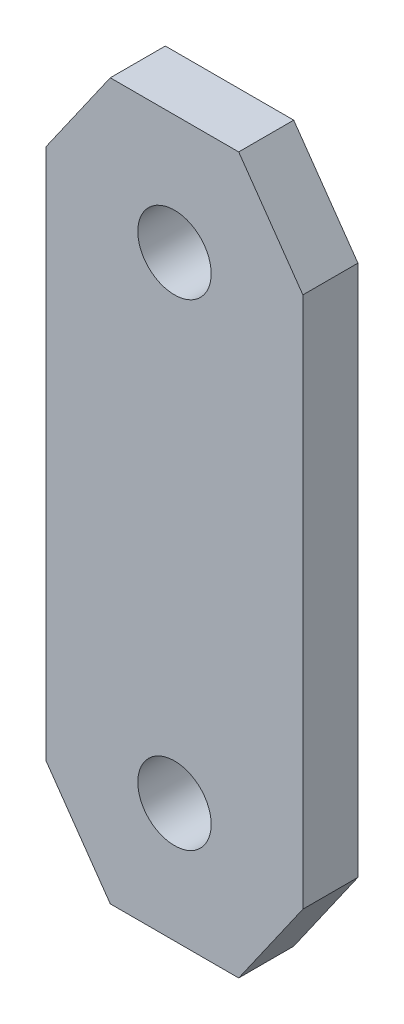
ISO-10303-21;
HEADER;
FILE_DESCRIPTION(('STEP AP214'),'2;1');
FILE_NAME('part.step','',(''),(''),'','','');
FILE_SCHEMA(('AUTOMOTIVE_DESIGN { 1 0 10303 214 1 1 1 1 }'));
ENDSEC;
DATA;
#1=APPLICATION_CONTEXT('core data for automotive mechanical design processes');
#2=APPLICATION_PROTOCOL_DEFINITION('international standard','automotive_design',2000,#1);
#3=PRODUCT_CONTEXT('',#1,'mechanical');
#4=PRODUCT('Part','Part','',(#3));
#5=PRODUCT_RELATED_PRODUCT_CATEGORY('part','',(#4));
#6=PRODUCT_DEFINITION_FORMATION('','',#4);
#7=PRODUCT_DEFINITION_CONTEXT('part definition',#1,'design');
#8=PRODUCT_DEFINITION('design','',#6,#7);
#9=PRODUCT_DEFINITION_SHAPE('','',#8);
#10=(LENGTH_UNIT() NAMED_UNIT(*) SI_UNIT(.MILLI.,.METRE.));
#11=(NAMED_UNIT(*) PLANE_ANGLE_UNIT() SI_UNIT($,.RADIAN.));
#12=(NAMED_UNIT(*) SI_UNIT($,.STERADIAN.) SOLID_ANGLE_UNIT());
#13=UNCERTAINTY_MEASURE_WITH_UNIT(LENGTH_MEASURE(1.E-05),#10,'distance_accuracy_value','');
#14=(GEOMETRIC_REPRESENTATION_CONTEXT(3) GLOBAL_UNCERTAINTY_ASSIGNED_CONTEXT((#13)) GLOBAL_UNIT_ASSIGNED_CONTEXT((#10,
#11,#12)) REPRESENTATION_CONTEXT('',''));
#15=CARTESIAN_POINT('',(0.,0.,0.));
#16=DIRECTION('',(0.,0.,1.));
#17=DIRECTION('',(1.,0.,0.));
#18=AXIS2_PLACEMENT_3D('',#15,#16,#17);
#19=CARTESIAN_POINT('',(3.5,19.5,3.));
#20=DIRECTION('',(0.,-1.,0.));
#21=DIRECTION('',(0.,0.,-1.));
#22=AXIS2_PLACEMENT_3D('',#19,#20,#21);
#23=PLANE('',#22);
#24=DIRECTION('',(-1.,0.,0.));
#25=VECTOR('',#24,1.);
#26=CARTESIAN_POINT('',(3.5,19.5,0.));
#27=LINE('',#26,#25);
#28=CARTESIAN_POINT('',(3.5,19.5,0.));
#29=VERTEX_POINT('',#28);
#30=CARTESIAN_POINT('',(-3.5,19.5,0.));
#31=VERTEX_POINT('',#30);
#32=EDGE_CURVE('E137',#29,#31,#27,.T.);
#33=ORIENTED_EDGE('',*,*,#32,.T.);
#34=DIRECTION('',(0.,0.,-1.));
#35=VECTOR('',#34,1.);
#36=CARTESIAN_POINT('',(-3.5,19.5,3.));
#37=LINE('',#36,#35);
#38=CARTESIAN_POINT('',(-3.5,19.5,3.));
#39=VERTEX_POINT('',#38);
#40=EDGE_CURVE('E11',#39,#31,#37,.T.);
#41=ORIENTED_EDGE('',*,*,#40,.F.);
#42=DIRECTION('',(-1.,0.,0.));
#43=VECTOR('',#42,1.);
#44=CARTESIAN_POINT('',(3.5,19.5,3.));
#45=LINE('',#44,#43);
#46=CARTESIAN_POINT('',(3.5,19.5,3.));
#47=VERTEX_POINT('',#46);
#48=EDGE_CURVE('E152',#47,#39,#45,.T.);
#49=ORIENTED_EDGE('',*,*,#48,.F.);
#50=DIRECTION('',(0.,0.,-1.));
#51=VECTOR('',#50,1.);
#52=CARTESIAN_POINT('',(3.5,19.5,3.));
#53=LINE('',#52,#51);
#54=EDGE_CURVE('E133',#47,#29,#53,.T.);
#55=ORIENTED_EDGE('',*,*,#54,.T.);
#56=EDGE_LOOP('',(#33,#41,#49,#55));
#57=FACE_BOUND('',#56,.T.);
#58=ADVANCED_FACE('F41',(#57),#23,.F.);
#59=CARTESIAN_POINT('',(-3.5,19.5,3.));
#60=DIRECTION('',(0.81923192051904,-0.573462344363328,0.));
#61=DIRECTION('',(0.573462344363328,0.819231920519041,0.));
#62=AXIS2_PLACEMENT_3D('',#59,#60,#61);
#63=PLANE('',#62);
#64=DIRECTION('',(-0.573462344363328,-0.819231920519041,0.));
#65=VECTOR('',#64,1.);
#66=CARTESIAN_POINT('',(-3.5,19.5,0.));
#67=LINE('',#66,#65);
#68=CARTESIAN_POINT('',(-7.,14.5,0.));
#69=VERTEX_POINT('',#68);
#70=EDGE_CURVE('E140',#31,#69,#67,.T.);
#71=ORIENTED_EDGE('',*,*,#70,.T.);
#72=DIRECTION('',(0.,0.,-1.));
#73=VECTOR('',#72,1.);
#74=CARTESIAN_POINT('',(-7.,14.5,3.));
#75=LINE('',#74,#73);
#76=CARTESIAN_POINT('',(-7.,14.5,3.));
#77=VERTEX_POINT('',#76);
#78=EDGE_CURVE('E49',#77,#69,#75,.T.);
#79=ORIENTED_EDGE('',*,*,#78,.F.);
#80=DIRECTION('',(-0.573462344363328,-0.819231920519041,0.));
#81=VECTOR('',#80,1.);
#82=CARTESIAN_POINT('',(-3.5,19.5,3.));
#83=LINE('',#82,#81);
#84=EDGE_CURVE('E100',#39,#77,#83,.T.);
#85=ORIENTED_EDGE('',*,*,#84,.F.);
#86=ORIENTED_EDGE('',*,*,#40,.T.);
#87=EDGE_LOOP('',(#71,#79,#85,#86));
#88=FACE_BOUND('',#87,.T.);
#89=ADVANCED_FACE('F221',(#88),#63,.F.);
#90=CARTESIAN_POINT('',(-7.,-14.5,3.));
#91=DIRECTION('',(1.,0.,0.));
#92=DIRECTION('',(0.,1.,0.));
#93=AXIS2_PLACEMENT_3D('',#90,#91,#92);
#94=PLANE('',#93);
#95=DIRECTION('',(0.,-1.,0.));
#96=VECTOR('',#95,1.);
#97=CARTESIAN_POINT('',(-7.,-14.5,0.));
#98=LINE('',#97,#96);
#99=CARTESIAN_POINT('',(-7.,-14.5,0.));
#100=VERTEX_POINT('',#99);
#101=EDGE_CURVE('E143',#69,#100,#98,.T.);
#102=ORIENTED_EDGE('',*,*,#101,.T.);
#103=DIRECTION('',(0.,0.,-1.));
#104=VECTOR('',#103,1.);
#105=CARTESIAN_POINT('',(-7.,-14.5,3.));
#106=LINE('',#105,#104);
#107=CARTESIAN_POINT('',(-7.,-14.5,3.));
#108=VERTEX_POINT('',#107);
#109=EDGE_CURVE('E159',#108,#100,#106,.T.);
#110=ORIENTED_EDGE('',*,*,#109,.F.);
#111=DIRECTION('',(0.,-1.,0.));
#112=VECTOR('',#111,1.);
#113=CARTESIAN_POINT('',(-7.,-14.5,3.));
#114=LINE('',#113,#112);
#115=EDGE_CURVE('E167',#77,#108,#114,.T.);
#116=ORIENTED_EDGE('',*,*,#115,.F.);
#117=ORIENTED_EDGE('',*,*,#78,.T.);
#118=EDGE_LOOP('',(#102,#110,#116,#117));
#119=FACE_BOUND('',#118,.T.);
#120=ADVANCED_FACE('F165',(#119),#94,.F.);
#121=CARTESIAN_POINT('',(-3.5,-19.5,3.));
#122=DIRECTION('',(0.81923192051904,0.573462344363328,0.));
#123=DIRECTION('',(-0.573462344363328,0.819231920519041,0.));
#124=AXIS2_PLACEMENT_3D('',#121,#122,#123);
#125=PLANE('',#124);
#126=DIRECTION('',(0.573462344363328,-0.819231920519041,0.));
#127=VECTOR('',#126,1.);
#128=CARTESIAN_POINT('',(-3.5,-19.5,0.));
#129=LINE('',#128,#127);
#130=CARTESIAN_POINT('',(-3.5,-19.5,0.));
#131=VERTEX_POINT('',#130);
#132=EDGE_CURVE('E145',#100,#131,#129,.T.);
#133=ORIENTED_EDGE('',*,*,#132,.T.);
#134=DIRECTION('',(0.,0.,-1.));
#135=VECTOR('',#134,1.);
#136=CARTESIAN_POINT('',(-3.5,-19.5,3.));
#137=LINE('',#136,#135);
#138=CARTESIAN_POINT('',(-3.5,-19.5,3.));
#139=VERTEX_POINT('',#138);
#140=EDGE_CURVE('E156',#139,#131,#137,.T.);
#141=ORIENTED_EDGE('',*,*,#140,.F.);
#142=DIRECTION('',(0.573462344363328,-0.819231920519041,0.));
#143=VECTOR('',#142,1.);
#144=CARTESIAN_POINT('',(-3.5,-19.5,3.));
#145=LINE('',#144,#143);
#146=EDGE_CURVE('E179',#108,#139,#145,.T.);
#147=ORIENTED_EDGE('',*,*,#146,.F.);
#148=ORIENTED_EDGE('',*,*,#109,.T.);
#149=EDGE_LOOP('',(#133,#141,#147,#148));
#150=FACE_BOUND('',#149,.T.);
#151=ADVANCED_FACE('F175',(#150),#125,.F.);
#152=CARTESIAN_POINT('',(3.5,-19.5,3.));
#153=DIRECTION('',(0.,1.,0.));
#154=DIRECTION('',(0.,0.,1.));
#155=AXIS2_PLACEMENT_3D('',#152,#153,#154);
#156=PLANE('',#155);
#157=DIRECTION('',(1.,0.,0.));
#158=VECTOR('',#157,1.);
#159=CARTESIAN_POINT('',(3.5,-19.5,0.));
#160=LINE('',#159,#158);
#161=CARTESIAN_POINT('',(3.5,-19.5,0.));
#162=VERTEX_POINT('',#161);
#163=EDGE_CURVE('E147',#131,#162,#160,.T.);
#164=ORIENTED_EDGE('',*,*,#163,.T.);
#165=DIRECTION('',(0.,0.,-1.));
#166=VECTOR('',#165,1.);
#167=CARTESIAN_POINT('',(3.5,-19.5,3.));
#168=LINE('',#167,#166);
#169=CARTESIAN_POINT('',(3.5,-19.5,3.));
#170=VERTEX_POINT('',#169);
#171=EDGE_CURVE('E128',#170,#162,#168,.T.);
#172=ORIENTED_EDGE('',*,*,#171,.F.);
#173=DIRECTION('',(1.,0.,0.));
#174=VECTOR('',#173,1.);
#175=CARTESIAN_POINT('',(3.5,-19.5,3.));
#176=LINE('',#175,#174);
#177=EDGE_CURVE('E119',#139,#170,#176,.T.);
#178=ORIENTED_EDGE('',*,*,#177,.F.);
#179=ORIENTED_EDGE('',*,*,#140,.T.);
#180=EDGE_LOOP('',(#164,#172,#178,#179));
#181=FACE_BOUND('',#180,.T.);
#182=ADVANCED_FACE('F178',(#181),#156,.F.);
#183=CARTESIAN_POINT('',(7.,-14.5,3.));
#184=DIRECTION('',(-0.819231920519041,0.573462344363328,0.));
#185=DIRECTION('',(-0.573462344363328,-0.819231920519041,0.));
#186=AXIS2_PLACEMENT_3D('',#183,#184,#185);
#187=PLANE('',#186);
#188=DIRECTION('',(0.573462344363328,0.819231920519041,0.));
#189=VECTOR('',#188,1.);
#190=CARTESIAN_POINT('',(7.,-14.5,0.));
#191=LINE('',#190,#189);
#192=CARTESIAN_POINT('',(7.,-14.5,0.));
#193=VERTEX_POINT('',#192);
#194=EDGE_CURVE('E127',#162,#193,#191,.T.);
#195=ORIENTED_EDGE('',*,*,#194,.T.);
#196=DIRECTION('',(0.,0.,-1.));
#197=VECTOR('',#196,1.);
#198=CARTESIAN_POINT('',(7.,-14.5,3.));
#199=LINE('',#198,#197);
#200=CARTESIAN_POINT('',(7.,-14.5,3.));
#201=VERTEX_POINT('',#200);
#202=EDGE_CURVE('E124',#201,#193,#199,.T.);
#203=ORIENTED_EDGE('',*,*,#202,.F.);
#204=DIRECTION('',(0.573462344363328,0.819231920519041,0.));
#205=VECTOR('',#204,1.);
#206=CARTESIAN_POINT('',(7.,-14.5,3.));
#207=LINE('',#206,#205);
#208=EDGE_CURVE('E113',#170,#201,#207,.T.);
#209=ORIENTED_EDGE('',*,*,#208,.F.);
#210=ORIENTED_EDGE('',*,*,#171,.T.);
#211=EDGE_LOOP('',(#195,#203,#209,#210));
#212=FACE_BOUND('',#211,.T.);
#213=ADVANCED_FACE('F125',(#212),#187,.F.);
#214=CARTESIAN_POINT('',(7.,-14.5,3.));
#215=DIRECTION('',(-1.,0.,0.));
#216=DIRECTION('',(0.,0.,1.));
#217=AXIS2_PLACEMENT_3D('',#214,#215,#216);
#218=PLANE('',#217);
#219=DIRECTION('',(0.,1.,0.));
#220=VECTOR('',#219,1.);
#221=CARTESIAN_POINT('',(7.,-14.5,0.));
#222=LINE('',#221,#220);
#223=CARTESIAN_POINT('',(7.,14.5,0.));
#224=VERTEX_POINT('',#223);
#225=EDGE_CURVE('E86',#193,#224,#222,.T.);
#226=ORIENTED_EDGE('',*,*,#225,.T.);
#227=DIRECTION('',(0.,0.,-1.));
#228=VECTOR('',#227,1.);
#229=CARTESIAN_POINT('',(7.,14.5,3.));
#230=LINE('',#229,#228);
#231=CARTESIAN_POINT('',(7.,14.5,3.));
#232=VERTEX_POINT('',#231);
#233=EDGE_CURVE('E129',#232,#224,#230,.T.);
#234=ORIENTED_EDGE('',*,*,#233,.F.);
#235=DIRECTION('',(0.,1.,0.));
#236=VECTOR('',#235,1.);
#237=CARTESIAN_POINT('',(7.,-14.5,3.));
#238=LINE('',#237,#236);
#239=EDGE_CURVE('E117',#201,#232,#238,.T.);
#240=ORIENTED_EDGE('',*,*,#239,.F.);
#241=ORIENTED_EDGE('',*,*,#202,.T.);
#242=EDGE_LOOP('',(#226,#234,#240,#241));
#243=FACE_BOUND('',#242,.T.);
#244=ADVANCED_FACE('F131',(#243),#218,.F.);
#245=CARTESIAN_POINT('',(7.,14.5,3.));
#246=DIRECTION('',(-0.81923192051904,-0.573462344363328,0.));
#247=DIRECTION('',(0.573462344363328,-0.819231920519041,0.));
#248=AXIS2_PLACEMENT_3D('',#245,#246,#247);
#249=PLANE('',#248);
#250=DIRECTION('',(-0.573462344363328,0.819231920519041,0.));
#251=VECTOR('',#250,1.);
#252=CARTESIAN_POINT('',(7.,14.5,0.));
#253=LINE('',#252,#251);
#254=EDGE_CURVE('E92',#224,#29,#253,.T.);
#255=ORIENTED_EDGE('',*,*,#254,.T.);
#256=ORIENTED_EDGE('',*,*,#54,.F.);
#257=DIRECTION('',(-0.573462344363328,0.819231920519041,0.));
#258=VECTOR('',#257,1.);
#259=CARTESIAN_POINT('',(7.,14.5,3.));
#260=LINE('',#259,#258);
#261=EDGE_CURVE('E57',#232,#47,#260,.T.);
#262=ORIENTED_EDGE('',*,*,#261,.F.);
#263=ORIENTED_EDGE('',*,*,#233,.T.);
#264=EDGE_LOOP('',(#255,#256,#262,#263));
#265=FACE_BOUND('',#264,.T.);
#266=ADVANCED_FACE('F208',(#265),#249,.F.);
#267=CARTESIAN_POINT('',(0.,0.,3.));
#268=DIRECTION('',(0.,0.,-1.));
#269=DIRECTION('',(-1.,0.,0.));
#270=AXIS2_PLACEMENT_3D('',#267,#268,#269);
#271=PLANE('',#270);
#272=CARTESIAN_POINT('',(0.,13.,3.));
#273=DIRECTION('',(0.,0.,1.));
#274=DIRECTION('',(1.,0.,0.));
#275=AXIS2_PLACEMENT_3D('',#272,#273,#274);
#276=CIRCLE('',#275,2.);
#277=CARTESIAN_POINT('',(2.,13.,3.));
#278=VERTEX_POINT('',#277);
#279=EDGE_CURVE('E191',#278,#278,#276,.T.);
#280=ORIENTED_EDGE('',*,*,#279,.F.);
#281=EDGE_LOOP('',(#280));
#282=FACE_BOUND('',#281,.T.);
#283=CARTESIAN_POINT('',(0.,-13.,3.));
#284=DIRECTION('',(0.,0.,1.));
#285=DIRECTION('',(1.,0.,0.));
#286=AXIS2_PLACEMENT_3D('',#283,#284,#285);
#287=CIRCLE('',#286,2.);
#288=CARTESIAN_POINT('',(2.,-13.,3.));
#289=VERTEX_POINT('',#288);
#290=EDGE_CURVE('E188',#289,#289,#287,.T.);
#291=ORIENTED_EDGE('',*,*,#290,.F.);
#292=EDGE_LOOP('',(#291));
#293=FACE_BOUND('',#292,.T.);
#294=ORIENTED_EDGE('',*,*,#48,.T.);
#295=ORIENTED_EDGE('',*,*,#84,.T.);
#296=ORIENTED_EDGE('',*,*,#115,.T.);
#297=ORIENTED_EDGE('',*,*,#146,.T.);
#298=ORIENTED_EDGE('',*,*,#177,.T.);
#299=ORIENTED_EDGE('',*,*,#208,.T.);
#300=ORIENTED_EDGE('',*,*,#239,.T.);
#301=ORIENTED_EDGE('',*,*,#261,.T.);
#302=EDGE_LOOP('',(#294,#295,#296,#297,#298,#299,#300,#301));
#303=FACE_BOUND('',#302,.T.);
#304=ADVANCED_FACE('F115',(#282,#293,#303),#271,.F.);
#305=CARTESIAN_POINT('',(0.,0.,0.));
#306=DIRECTION('',(0.,0.,-1.));
#307=DIRECTION('',(-1.,0.,0.));
#308=AXIS2_PLACEMENT_3D('',#305,#306,#307);
#309=PLANE('',#308);
#310=CARTESIAN_POINT('',(0.,13.,0.));
#311=DIRECTION('',(0.,0.,1.));
#312=DIRECTION('',(1.,0.,0.));
#313=AXIS2_PLACEMENT_3D('',#310,#311,#312);
#314=CIRCLE('',#313,2.);
#315=CARTESIAN_POINT('',(2.,13.,0.));
#316=VERTEX_POINT('',#315);
#317=EDGE_CURVE('E141',#316,#316,#314,.T.);
#318=ORIENTED_EDGE('',*,*,#317,.T.);
#319=EDGE_LOOP('',(#318));
#320=FACE_BOUND('',#319,.T.);
#321=CARTESIAN_POINT('',(0.,-13.,0.));
#322=DIRECTION('',(0.,0.,1.));
#323=DIRECTION('',(1.,0.,0.));
#324=AXIS2_PLACEMENT_3D('',#321,#322,#323);
#325=CIRCLE('',#324,2.);
#326=CARTESIAN_POINT('',(2.,-13.,0.));
#327=VERTEX_POINT('',#326);
#328=EDGE_CURVE('E185',#327,#327,#325,.T.);
#329=ORIENTED_EDGE('',*,*,#328,.T.);
#330=EDGE_LOOP('',(#329));
#331=FACE_BOUND('',#330,.T.);
#332=ORIENTED_EDGE('',*,*,#32,.F.);
#333=ORIENTED_EDGE('',*,*,#254,.F.);
#334=ORIENTED_EDGE('',*,*,#225,.F.);
#335=ORIENTED_EDGE('',*,*,#194,.F.);
#336=ORIENTED_EDGE('',*,*,#163,.F.);
#337=ORIENTED_EDGE('',*,*,#132,.F.);
#338=ORIENTED_EDGE('',*,*,#101,.F.);
#339=ORIENTED_EDGE('',*,*,#70,.F.);
#340=EDGE_LOOP('',(#332,#333,#334,#335,#336,#337,#338,#339));
#341=FACE_BOUND('',#340,.T.);
#342=ADVANCED_FACE('F171',(#320,#331,#341),#309,.T.);
#343=CARTESIAN_POINT('',(0.,-13.,0.));
#344=DIRECTION('',(0.,0.,1.));
#345=DIRECTION('',(1.,0.,0.));
#346=AXIS2_PLACEMENT_3D('',#343,#344,#345);
#347=CYLINDRICAL_SURFACE('',#346,2.);
#348=ORIENTED_EDGE('',*,*,#328,.F.);
#349=EDGE_LOOP('',(#348));
#350=FACE_BOUND('',#349,.T.);
#351=ORIENTED_EDGE('',*,*,#290,.T.);
#352=EDGE_LOOP('',(#351));
#353=FACE_BOUND('',#352,.T.);
#354=ADVANCED_FACE('F202',(#350,#353),#347,.F.);
#355=CARTESIAN_POINT('',(0.,13.,0.));
#356=DIRECTION('',(0.,0.,1.));
#357=DIRECTION('',(1.,0.,0.));
#358=AXIS2_PLACEMENT_3D('',#355,#356,#357);
#359=CYLINDRICAL_SURFACE('',#358,2.);
#360=ORIENTED_EDGE('',*,*,#317,.F.);
#361=EDGE_LOOP('',(#360));
#362=FACE_BOUND('',#361,.T.);
#363=ORIENTED_EDGE('',*,*,#279,.T.);
#364=EDGE_LOOP('',(#363));
#365=FACE_BOUND('',#364,.T.);
#366=ADVANCED_FACE('F199',(#362,#365),#359,.F.);
#367=CLOSED_SHELL('',(#58,#89,#120,#151,#182,#213,#244,#266,#304,#342,#354,#366));
#368=MANIFOLD_SOLID_BREP('B2',#367);
#369=ADVANCED_BREP_SHAPE_REPRESENTATION('',(#18,#368),#14);
#370=SHAPE_DEFINITION_REPRESENTATION(#9,#369);
ENDSEC;
END-ISO-10303-21;
